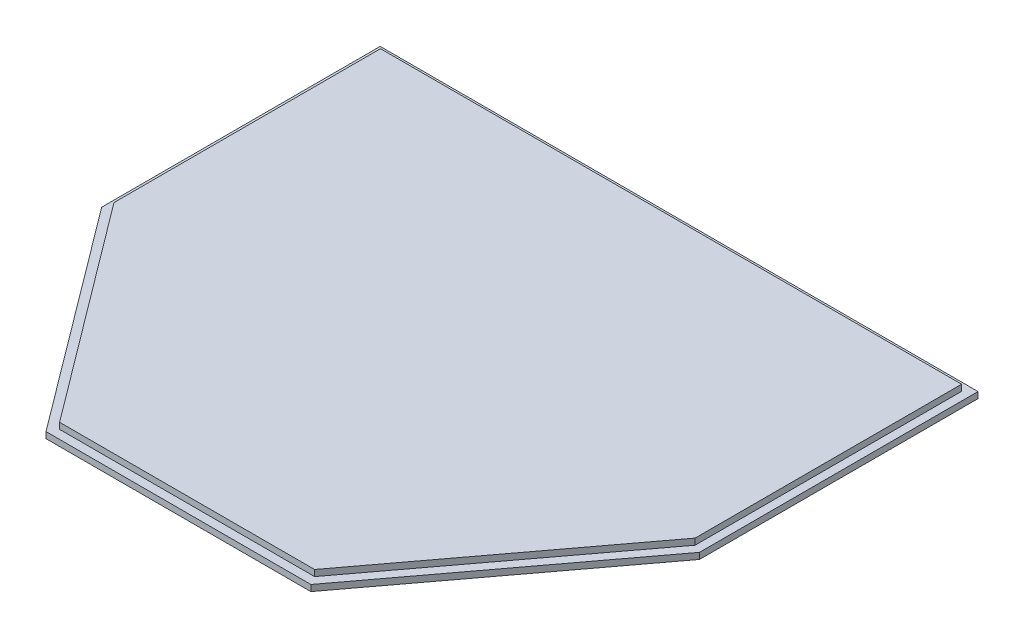
ISO-10303-21;
HEADER;
FILE_DESCRIPTION(('STEP AP214'),'2;1');
FILE_NAME('part.step','',(''),(''),'','','');
FILE_SCHEMA(('AUTOMOTIVE_DESIGN { 1 0 10303 214 1 1 1 1 }'));
ENDSEC;
DATA;
#1=APPLICATION_CONTEXT('core data for automotive mechanical design processes');
#2=APPLICATION_PROTOCOL_DEFINITION('international standard','automotive_design',2000,#1);
#3=PRODUCT_CONTEXT('',#1,'mechanical');
#4=PRODUCT('Part','Part','',(#3));
#5=PRODUCT_RELATED_PRODUCT_CATEGORY('part','',(#4));
#6=PRODUCT_DEFINITION_FORMATION('','',#4);
#7=PRODUCT_DEFINITION_CONTEXT('part definition',#1,'design');
#8=PRODUCT_DEFINITION('design','',#6,#7);
#9=PRODUCT_DEFINITION_SHAPE('','',#8);
#10=(LENGTH_UNIT() NAMED_UNIT(*) SI_UNIT(.MILLI.,.METRE.));
#11=(NAMED_UNIT(*) PLANE_ANGLE_UNIT() SI_UNIT($,.RADIAN.));
#12=(NAMED_UNIT(*) SI_UNIT($,.STERADIAN.) SOLID_ANGLE_UNIT());
#13=UNCERTAINTY_MEASURE_WITH_UNIT(LENGTH_MEASURE(1.E-05),#10,'distance_accuracy_value','');
#14=(GEOMETRIC_REPRESENTATION_CONTEXT(3) GLOBAL_UNCERTAINTY_ASSIGNED_CONTEXT((#13)) GLOBAL_UNIT_ASSIGNED_CONTEXT((#10,
#11,#12)) REPRESENTATION_CONTEXT('',''));
#15=CARTESIAN_POINT('',(0.,0.,0.));
#16=DIRECTION('',(0.,0.,1.));
#17=DIRECTION('',(1.,0.,0.));
#18=AXIS2_PLACEMENT_3D('',#15,#16,#17);
#19=CARTESIAN_POINT('',(0.,5.,0.));
#20=DIRECTION('',(0.,-1.,0.));
#21=DIRECTION('',(0.,0.,-1.));
#22=AXIS2_PLACEMENT_3D('',#19,#20,#21);
#23=PLANE('',#22);
#24=DIRECTION('',(0.599643275225182,0.,0.800267419352567));
#25=VECTOR('',#24,1.);
#26=CARTESIAN_POINT('',(-241.5,5.,225.));
#27=LINE('',#26,#25);
#28=CARTESIAN_POINT('',(-241.5,5.,225.));
#29=VERTEX_POINT('',#28);
#30=CARTESIAN_POINT('',(-107.,5.,404.5));
#31=VERTEX_POINT('',#30);
#32=EDGE_CURVE('E153',#29,#31,#27,.T.);
#33=ORIENTED_EDGE('',*,*,#32,.T.);
#34=DIRECTION('',(1.,0.,0.));
#35=VECTOR('',#34,1.);
#36=CARTESIAN_POINT('',(107.,5.,404.5));
#37=LINE('',#36,#35);
#38=CARTESIAN_POINT('',(107.,5.,404.5));
#39=VERTEX_POINT('',#38);
#40=EDGE_CURVE('E156',#31,#39,#37,.T.);
#41=ORIENTED_EDGE('',*,*,#40,.T.);
#42=DIRECTION('',(0.599643275225182,0.,-0.800267419352567));
#43=VECTOR('',#42,1.);
#44=CARTESIAN_POINT('',(241.5,5.,225.));
#45=LINE('',#44,#43);
#46=CARTESIAN_POINT('',(241.5,5.,225.));
#47=VERTEX_POINT('',#46);
#48=EDGE_CURVE('E159',#39,#47,#45,.T.);
#49=ORIENTED_EDGE('',*,*,#48,.T.);
#50=DIRECTION('',(0.,0.,-1.));
#51=VECTOR('',#50,1.);
#52=CARTESIAN_POINT('',(241.5,5.,0.));
#53=LINE('',#52,#51);
#54=CARTESIAN_POINT('',(241.5,5.,0.));
#55=VERTEX_POINT('',#54);
#56=EDGE_CURVE('E161',#47,#55,#53,.T.);
#57=ORIENTED_EDGE('',*,*,#56,.T.);
#58=DIRECTION('',(-1.,0.,0.));
#59=VECTOR('',#58,1.);
#60=CARTESIAN_POINT('',(-241.5,5.,0.));
#61=LINE('',#60,#59);
#62=CARTESIAN_POINT('',(-241.5,5.,0.));
#63=VERTEX_POINT('',#62);
#64=EDGE_CURVE('E163',#55,#63,#61,.T.);
#65=ORIENTED_EDGE('',*,*,#64,.T.);
#66=DIRECTION('',(0.,0.,1.));
#67=VECTOR('',#66,1.);
#68=CARTESIAN_POINT('',(-241.5,5.,0.));
#69=LINE('',#68,#67);
#70=EDGE_CURVE('E165',#63,#29,#69,.T.);
#71=ORIENTED_EDGE('',*,*,#70,.T.);
#72=EDGE_LOOP('',(#33,#41,#49,#57,#65,#71));
#73=FACE_BOUND('',#72,.T.);
#74=DIRECTION('',(0.,0.,1.));
#75=VECTOR('',#74,1.);
#76=CARTESIAN_POINT('',(-234.75,5.,221.833333333333));
#77=LINE('',#76,#75);
#78=CARTESIAN_POINT('',(-234.75,5.,6.50000000000001));
#79=VERTEX_POINT('',#78);
#80=CARTESIAN_POINT('',(-234.75,5.,221.833333333333));
#81=VERTEX_POINT('',#80);
#82=EDGE_CURVE('E50',#79,#81,#77,.T.);
#83=ORIENTED_EDGE('',*,*,#82,.F.);
#84=DIRECTION('',(-1.,0.,0.));
#85=VECTOR('',#84,1.);
#86=CARTESIAN_POINT('',(-234.75,5.,6.50000000000001));
#87=LINE('',#86,#85);
#88=CARTESIAN_POINT('',(234.75,5.,6.50000000000001));
#89=VERTEX_POINT('',#88);
#90=EDGE_CURVE('E54',#89,#79,#87,.T.);
#91=ORIENTED_EDGE('',*,*,#90,.F.);
#92=DIRECTION('',(0.,0.,-1.));
#93=VECTOR('',#92,1.);
#94=CARTESIAN_POINT('',(234.75,5.,6.50000000000001));
#95=LINE('',#94,#93);
#96=CARTESIAN_POINT('',(234.75,5.,221.833333333332));
#97=VERTEX_POINT('',#96);
#98=EDGE_CURVE('E347',#97,#89,#95,.T.);
#99=ORIENTED_EDGE('',*,*,#98,.F.);
#100=DIRECTION('',(0.599999999999998,0.,-0.800000000000001));
#101=VECTOR('',#100,1.);
#102=CARTESIAN_POINT('',(234.75,5.,221.833333333332));
#103=LINE('',#102,#101);
#104=CARTESIAN_POINT('',(103.,5.,397.5));
#105=VERTEX_POINT('',#104);
#106=EDGE_CURVE('E362',#105,#97,#103,.T.);
#107=ORIENTED_EDGE('',*,*,#106,.F.);
#108=DIRECTION('',(1.,0.,0.));
#109=VECTOR('',#108,1.);
#110=CARTESIAN_POINT('',(103.,5.,397.5));
#111=LINE('',#110,#109);
#112=CARTESIAN_POINT('',(-103.,5.,397.5));
#113=VERTEX_POINT('',#112);
#114=EDGE_CURVE('E365',#113,#105,#111,.T.);
#115=ORIENTED_EDGE('',*,*,#114,.F.);
#116=DIRECTION('',(0.599999999999999,0.,0.800000000000001));
#117=VECTOR('',#116,1.);
#118=CARTESIAN_POINT('',(-103.,5.,397.5));
#119=LINE('',#118,#117);
#120=EDGE_CURVE('E366',#81,#113,#119,.T.);
#121=ORIENTED_EDGE('',*,*,#120,.F.);
#122=EDGE_LOOP('',(#83,#91,#99,#107,#115,#121));
#123=FACE_BOUND('',#122,.T.);
#124=ADVANCED_FACE('F35',(#73,#123),#23,.F.);
#125=CARTESIAN_POINT('',(-241.5,5.,225.));
#126=DIRECTION('',(0.800267419352567,0.,-0.599643275225182));
#127=DIRECTION('',(-0.599643275225182,0.,-0.800267419352567));
#128=AXIS2_PLACEMENT_3D('',#125,#126,#127);
#129=PLANE('',#128);
#130=DIRECTION('',(0.599643275225182,0.,0.800267419352567));
#131=VECTOR('',#130,1.);
#132=CARTESIAN_POINT('',(-241.5,0.,225.));
#133=LINE('',#132,#131);
#134=CARTESIAN_POINT('',(-241.5,0.,225.));
#135=VERTEX_POINT('',#134);
#136=CARTESIAN_POINT('',(-107.,0.,404.5));
#137=VERTEX_POINT('',#136);
#138=EDGE_CURVE('E144',#135,#137,#133,.T.);
#139=ORIENTED_EDGE('',*,*,#138,.T.);
#140=DIRECTION('',(0.,-1.,0.));
#141=VECTOR('',#140,1.);
#142=CARTESIAN_POINT('',(-107.,5.,404.5));
#143=LINE('',#142,#141);
#144=EDGE_CURVE('E11',#31,#137,#143,.T.);
#145=ORIENTED_EDGE('',*,*,#144,.F.);
#146=ORIENTED_EDGE('',*,*,#32,.F.);
#147=DIRECTION('',(0.,-1.,0.));
#148=VECTOR('',#147,1.);
#149=CARTESIAN_POINT('',(-241.5,5.,225.));
#150=LINE('',#149,#148);
#151=EDGE_CURVE('E166',#29,#135,#150,.T.);
#152=ORIENTED_EDGE('',*,*,#151,.T.);
#153=EDGE_LOOP('',(#139,#145,#146,#152));
#154=FACE_BOUND('',#153,.T.);
#155=ADVANCED_FACE('F37',(#154),#129,.F.);
#156=CARTESIAN_POINT('',(107.,5.,404.5));
#157=DIRECTION('',(0.,0.,-1.));
#158=DIRECTION('',(-1.,0.,0.));
#159=AXIS2_PLACEMENT_3D('',#156,#157,#158);
#160=PLANE('',#159);
#161=DIRECTION('',(1.,0.,0.));
#162=VECTOR('',#161,1.);
#163=CARTESIAN_POINT('',(107.,0.,404.5));
#164=LINE('',#163,#162);
#165=CARTESIAN_POINT('',(107.,0.,404.5));
#166=VERTEX_POINT('',#165);
#167=EDGE_CURVE('E147',#137,#166,#164,.T.);
#168=ORIENTED_EDGE('',*,*,#167,.T.);
#169=DIRECTION('',(0.,-1.,0.));
#170=VECTOR('',#169,1.);
#171=CARTESIAN_POINT('',(107.,5.,404.5));
#172=LINE('',#171,#170);
#173=EDGE_CURVE('E43',#39,#166,#172,.T.);
#174=ORIENTED_EDGE('',*,*,#173,.F.);
#175=ORIENTED_EDGE('',*,*,#40,.F.);
#176=ORIENTED_EDGE('',*,*,#144,.T.);
#177=EDGE_LOOP('',(#168,#174,#175,#176));
#178=FACE_BOUND('',#177,.T.);
#179=ADVANCED_FACE('F213',(#178),#160,.F.);
#180=CARTESIAN_POINT('',(241.5,5.,225.));
#181=DIRECTION('',(-0.800267419352567,0.,-0.599643275225182));
#182=DIRECTION('',(-0.599643275225182,0.,0.800267419352567));
#183=AXIS2_PLACEMENT_3D('',#180,#181,#182);
#184=PLANE('',#183);
#185=DIRECTION('',(0.599643275225182,0.,-0.800267419352567));
#186=VECTOR('',#185,1.);
#187=CARTESIAN_POINT('',(241.5,0.,225.));
#188=LINE('',#187,#186);
#189=CARTESIAN_POINT('',(241.5,0.,225.));
#190=VERTEX_POINT('',#189);
#191=EDGE_CURVE('E169',#166,#190,#188,.T.);
#192=ORIENTED_EDGE('',*,*,#191,.T.);
#193=DIRECTION('',(0.,-1.,0.));
#194=VECTOR('',#193,1.);
#195=CARTESIAN_POINT('',(241.5,5.,225.));
#196=LINE('',#195,#194);
#197=EDGE_CURVE('E184',#47,#190,#196,.T.);
#198=ORIENTED_EDGE('',*,*,#197,.F.);
#199=ORIENTED_EDGE('',*,*,#48,.F.);
#200=ORIENTED_EDGE('',*,*,#173,.T.);
#201=EDGE_LOOP('',(#192,#198,#199,#200));
#202=FACE_BOUND('',#201,.T.);
#203=ADVANCED_FACE('F191',(#202),#184,.F.);
#204=CARTESIAN_POINT('',(241.5,5.,0.));
#205=DIRECTION('',(-1.,0.,0.));
#206=DIRECTION('',(0.,0.,1.));
#207=AXIS2_PLACEMENT_3D('',#204,#205,#206);
#208=PLANE('',#207);
#209=DIRECTION('',(0.,0.,-1.));
#210=VECTOR('',#209,1.);
#211=CARTESIAN_POINT('',(241.5,0.,0.));
#212=LINE('',#211,#210);
#213=CARTESIAN_POINT('',(241.5,0.,0.));
#214=VERTEX_POINT('',#213);
#215=EDGE_CURVE('E171',#190,#214,#212,.T.);
#216=ORIENTED_EDGE('',*,*,#215,.T.);
#217=DIRECTION('',(0.,-1.,0.));
#218=VECTOR('',#217,1.);
#219=CARTESIAN_POINT('',(241.5,5.,0.));
#220=LINE('',#219,#218);
#221=EDGE_CURVE('E181',#55,#214,#220,.T.);
#222=ORIENTED_EDGE('',*,*,#221,.F.);
#223=ORIENTED_EDGE('',*,*,#56,.F.);
#224=ORIENTED_EDGE('',*,*,#197,.T.);
#225=EDGE_LOOP('',(#216,#222,#223,#224));
#226=FACE_BOUND('',#225,.T.);
#227=ADVANCED_FACE('F202',(#226),#208,.F.);
#228=CARTESIAN_POINT('',(-241.5,5.,0.));
#229=DIRECTION('',(0.,0.,1.));
#230=DIRECTION('',(1.,0.,0.));
#231=AXIS2_PLACEMENT_3D('',#228,#229,#230);
#232=PLANE('',#231);
#233=DIRECTION('',(-1.,0.,0.));
#234=VECTOR('',#233,1.);
#235=CARTESIAN_POINT('',(-241.5,0.,0.));
#236=LINE('',#235,#234);
#237=CARTESIAN_POINT('',(-241.5,0.,0.));
#238=VERTEX_POINT('',#237);
#239=EDGE_CURVE('E173',#214,#238,#236,.T.);
#240=ORIENTED_EDGE('',*,*,#239,.T.);
#241=DIRECTION('',(0.,-1.,0.));
#242=VECTOR('',#241,1.);
#243=CARTESIAN_POINT('',(-241.5,5.,0.));
#244=LINE('',#243,#242);
#245=EDGE_CURVE('E178',#63,#238,#244,.T.);
#246=ORIENTED_EDGE('',*,*,#245,.F.);
#247=ORIENTED_EDGE('',*,*,#64,.F.);
#248=ORIENTED_EDGE('',*,*,#221,.T.);
#249=EDGE_LOOP('',(#240,#246,#247,#248));
#250=FACE_BOUND('',#249,.T.);
#251=ADVANCED_FACE('F206',(#250),#232,.F.);
#252=CARTESIAN_POINT('',(-241.5,5.,0.));
#253=DIRECTION('',(1.,0.,0.));
#254=DIRECTION('',(0.,0.,-1.));
#255=AXIS2_PLACEMENT_3D('',#252,#253,#254);
#256=PLANE('',#255);
#257=DIRECTION('',(0.,0.,1.));
#258=VECTOR('',#257,1.);
#259=CARTESIAN_POINT('',(-241.5,0.,0.));
#260=LINE('',#259,#258);
#261=EDGE_CURVE('E157',#238,#135,#260,.T.);
#262=ORIENTED_EDGE('',*,*,#261,.T.);
#263=ORIENTED_EDGE('',*,*,#151,.F.);
#264=ORIENTED_EDGE('',*,*,#70,.F.);
#265=ORIENTED_EDGE('',*,*,#245,.T.);
#266=EDGE_LOOP('',(#262,#263,#264,#265));
#267=FACE_BOUND('',#266,.T.);
#268=ADVANCED_FACE('F216',(#267),#256,.F.);
#269=CARTESIAN_POINT('',(0.,0.,0.));
#270=DIRECTION('',(0.,-1.,0.));
#271=DIRECTION('',(0.,0.,-1.));
#272=AXIS2_PLACEMENT_3D('',#269,#270,#271);
#273=PLANE('',#272);
#274=ORIENTED_EDGE('',*,*,#138,.F.);
#275=ORIENTED_EDGE('',*,*,#261,.F.);
#276=ORIENTED_EDGE('',*,*,#239,.F.);
#277=ORIENTED_EDGE('',*,*,#215,.F.);
#278=ORIENTED_EDGE('',*,*,#191,.F.);
#279=ORIENTED_EDGE('',*,*,#167,.F.);
#280=EDGE_LOOP('',(#274,#275,#276,#277,#278,#279));
#281=FACE_BOUND('',#280,.T.);
#282=ADVANCED_FACE('F197',(#281),#273,.T.);
#283=CARTESIAN_POINT('',(-234.75,10.,221.833333333333));
#284=DIRECTION('',(1.,0.,0.));
#285=DIRECTION('',(0.,0.,-1.));
#286=AXIS2_PLACEMENT_3D('',#283,#284,#285);
#287=PLANE('',#286);
#288=ORIENTED_EDGE('',*,*,#82,.T.);
#289=DIRECTION('',(0.,-1.,0.));
#290=VECTOR('',#289,1.);
#291=CARTESIAN_POINT('',(-234.75,10.,221.833333333333));
#292=LINE('',#291,#290);
#293=CARTESIAN_POINT('',(-234.75,10.,221.833333333333));
#294=VERTEX_POINT('',#293);
#295=EDGE_CURVE('E127',#294,#81,#292,.T.);
#296=ORIENTED_EDGE('',*,*,#295,.F.);
#297=DIRECTION('',(0.,0.,1.));
#298=VECTOR('',#297,1.);
#299=CARTESIAN_POINT('',(-234.75,10.,221.833333333333));
#300=LINE('',#299,#298);
#301=CARTESIAN_POINT('',(-234.75,10.,6.50000000000001));
#302=VERTEX_POINT('',#301);
#303=EDGE_CURVE('E133',#302,#294,#300,.T.);
#304=ORIENTED_EDGE('',*,*,#303,.F.);
#305=DIRECTION('',(0.,-1.,0.));
#306=VECTOR('',#305,1.);
#307=CARTESIAN_POINT('',(-234.75,10.,6.50000000000001));
#308=LINE('',#307,#306);
#309=EDGE_CURVE('E344',#302,#79,#308,.T.);
#310=ORIENTED_EDGE('',*,*,#309,.T.);
#311=EDGE_LOOP('',(#288,#296,#304,#310));
#312=FACE_BOUND('',#311,.T.);
#313=ADVANCED_FACE('F143',(#312),#287,.F.);
#314=CARTESIAN_POINT('',(-103.,10.,397.5));
#315=DIRECTION('',(0.800000000000001,0.,-0.599999999999999));
#316=DIRECTION('',(-0.599999999999999,0.,-0.800000000000001));
#317=AXIS2_PLACEMENT_3D('',#314,#315,#316);
#318=PLANE('',#317);
#319=ORIENTED_EDGE('',*,*,#120,.T.);
#320=DIRECTION('',(0.,-1.,0.));
#321=VECTOR('',#320,1.);
#322=CARTESIAN_POINT('',(-103.,10.,397.5));
#323=LINE('',#322,#321);
#324=CARTESIAN_POINT('',(-103.,10.,397.5));
#325=VERTEX_POINT('',#324);
#326=EDGE_CURVE('E129',#325,#113,#323,.T.);
#327=ORIENTED_EDGE('',*,*,#326,.F.);
#328=DIRECTION('',(0.599999999999999,0.,0.800000000000001));
#329=VECTOR('',#328,1.);
#330=CARTESIAN_POINT('',(-103.,10.,397.5));
#331=LINE('',#330,#329);
#332=EDGE_CURVE('E122',#294,#325,#331,.T.);
#333=ORIENTED_EDGE('',*,*,#332,.F.);
#334=ORIENTED_EDGE('',*,*,#295,.T.);
#335=EDGE_LOOP('',(#319,#327,#333,#334));
#336=FACE_BOUND('',#335,.T.);
#337=ADVANCED_FACE('F125',(#336),#318,.F.);
#338=CARTESIAN_POINT('',(103.,10.,397.5));
#339=DIRECTION('',(0.,0.,-1.));
#340=DIRECTION('',(-1.,0.,0.));
#341=AXIS2_PLACEMENT_3D('',#338,#339,#340);
#342=PLANE('',#341);
#343=ORIENTED_EDGE('',*,*,#114,.T.);
#344=DIRECTION('',(0.,-1.,0.));
#345=VECTOR('',#344,1.);
#346=CARTESIAN_POINT('',(103.,10.,397.5));
#347=LINE('',#346,#345);
#348=CARTESIAN_POINT('',(103.,10.,397.5));
#349=VERTEX_POINT('',#348);
#350=EDGE_CURVE('E149',#349,#105,#347,.T.);
#351=ORIENTED_EDGE('',*,*,#350,.F.);
#352=DIRECTION('',(1.,0.,0.));
#353=VECTOR('',#352,1.);
#354=CARTESIAN_POINT('',(103.,10.,397.5));
#355=LINE('',#354,#353);
#356=EDGE_CURVE('E132',#325,#349,#355,.T.);
#357=ORIENTED_EDGE('',*,*,#356,.F.);
#358=ORIENTED_EDGE('',*,*,#326,.T.);
#359=EDGE_LOOP('',(#343,#351,#357,#358));
#360=FACE_BOUND('',#359,.T.);
#361=ADVANCED_FACE('F235',(#360),#342,.F.);
#362=CARTESIAN_POINT('',(234.75,10.,221.833333333332));
#363=DIRECTION('',(-0.800000000000001,0.,-0.599999999999998));
#364=DIRECTION('',(-0.599999999999998,0.,0.800000000000001));
#365=AXIS2_PLACEMENT_3D('',#362,#363,#364);
#366=PLANE('',#365);
#367=ORIENTED_EDGE('',*,*,#106,.T.);
#368=DIRECTION('',(0.,-1.,0.));
#369=VECTOR('',#368,1.);
#370=CARTESIAN_POINT('',(234.75,10.,221.833333333332));
#371=LINE('',#370,#369);
#372=CARTESIAN_POINT('',(234.75,10.,221.833333333332));
#373=VERTEX_POINT('',#372);
#374=EDGE_CURVE('E350',#373,#97,#371,.T.);
#375=ORIENTED_EDGE('',*,*,#374,.F.);
#376=DIRECTION('',(0.599999999999998,0.,-0.800000000000001));
#377=VECTOR('',#376,1.);
#378=CARTESIAN_POINT('',(234.75,10.,221.833333333332));
#379=LINE('',#378,#377);
#380=EDGE_CURVE('E363',#349,#373,#379,.T.);
#381=ORIENTED_EDGE('',*,*,#380,.F.);
#382=ORIENTED_EDGE('',*,*,#350,.T.);
#383=EDGE_LOOP('',(#367,#375,#381,#382));
#384=FACE_BOUND('',#383,.T.);
#385=ADVANCED_FACE('F238',(#384),#366,.F.);
#386=CARTESIAN_POINT('',(234.75,10.,6.50000000000001));
#387=DIRECTION('',(-1.,0.,0.));
#388=DIRECTION('',(0.,0.,1.));
#389=AXIS2_PLACEMENT_3D('',#386,#387,#388);
#390=PLANE('',#389);
#391=ORIENTED_EDGE('',*,*,#98,.T.);
#392=DIRECTION('',(0.,-1.,0.));
#393=VECTOR('',#392,1.);
#394=CARTESIAN_POINT('',(234.75,10.,6.50000000000001));
#395=LINE('',#394,#393);
#396=CARTESIAN_POINT('',(234.75,10.,6.50000000000001));
#397=VERTEX_POINT('',#396);
#398=EDGE_CURVE('E346',#397,#89,#395,.T.);
#399=ORIENTED_EDGE('',*,*,#398,.F.);
#400=DIRECTION('',(0.,0.,-1.));
#401=VECTOR('',#400,1.);
#402=CARTESIAN_POINT('',(234.75,10.,6.50000000000001));
#403=LINE('',#402,#401);
#404=EDGE_CURVE('E352',#373,#397,#403,.T.);
#405=ORIENTED_EDGE('',*,*,#404,.F.);
#406=ORIENTED_EDGE('',*,*,#374,.T.);
#407=EDGE_LOOP('',(#391,#399,#405,#406));
#408=FACE_BOUND('',#407,.T.);
#409=ADVANCED_FACE('F242',(#408),#390,.F.);
#410=CARTESIAN_POINT('',(-234.75,10.,6.50000000000001));
#411=DIRECTION('',(0.,0.,1.));
#412=DIRECTION('',(1.,0.,0.));
#413=AXIS2_PLACEMENT_3D('',#410,#411,#412);
#414=PLANE('',#413);
#415=ORIENTED_EDGE('',*,*,#90,.T.);
#416=ORIENTED_EDGE('',*,*,#309,.F.);
#417=DIRECTION('',(-1.,0.,0.));
#418=VECTOR('',#417,1.);
#419=CARTESIAN_POINT('',(-234.75,10.,6.50000000000001));
#420=LINE('',#419,#418);
#421=EDGE_CURVE('E138',#397,#302,#420,.T.);
#422=ORIENTED_EDGE('',*,*,#421,.F.);
#423=ORIENTED_EDGE('',*,*,#398,.T.);
#424=EDGE_LOOP('',(#415,#416,#422,#423));
#425=FACE_BOUND('',#424,.T.);
#426=ADVANCED_FACE('F246',(#425),#414,.F.);
#427=CARTESIAN_POINT('',(0.,10.,0.));
#428=DIRECTION('',(0.,-1.,0.));
#429=DIRECTION('',(0.,0.,-1.));
#430=AXIS2_PLACEMENT_3D('',#427,#428,#429);
#431=PLANE('',#430);
#432=ORIENTED_EDGE('',*,*,#303,.T.);
#433=ORIENTED_EDGE('',*,*,#332,.T.);
#434=ORIENTED_EDGE('',*,*,#356,.T.);
#435=ORIENTED_EDGE('',*,*,#380,.T.);
#436=ORIENTED_EDGE('',*,*,#404,.T.);
#437=ORIENTED_EDGE('',*,*,#421,.T.);
#438=EDGE_LOOP('',(#432,#433,#434,#435,#436,#437));
#439=FACE_BOUND('',#438,.T.);
#440=ADVANCED_FACE('F136',(#439),#431,.F.);
#441=CLOSED_SHELL('',(#124,#155,#179,#203,#227,#251,#268,#282,#313,#337,#361,#385,#409,#426,#440));
#442=MANIFOLD_SOLID_BREP('B2',#441);
#443=ADVANCED_BREP_SHAPE_REPRESENTATION('',(#18,#442),#14);
#444=SHAPE_DEFINITION_REPRESENTATION(#9,#443);
ENDSEC;
END-ISO-10303-21;
